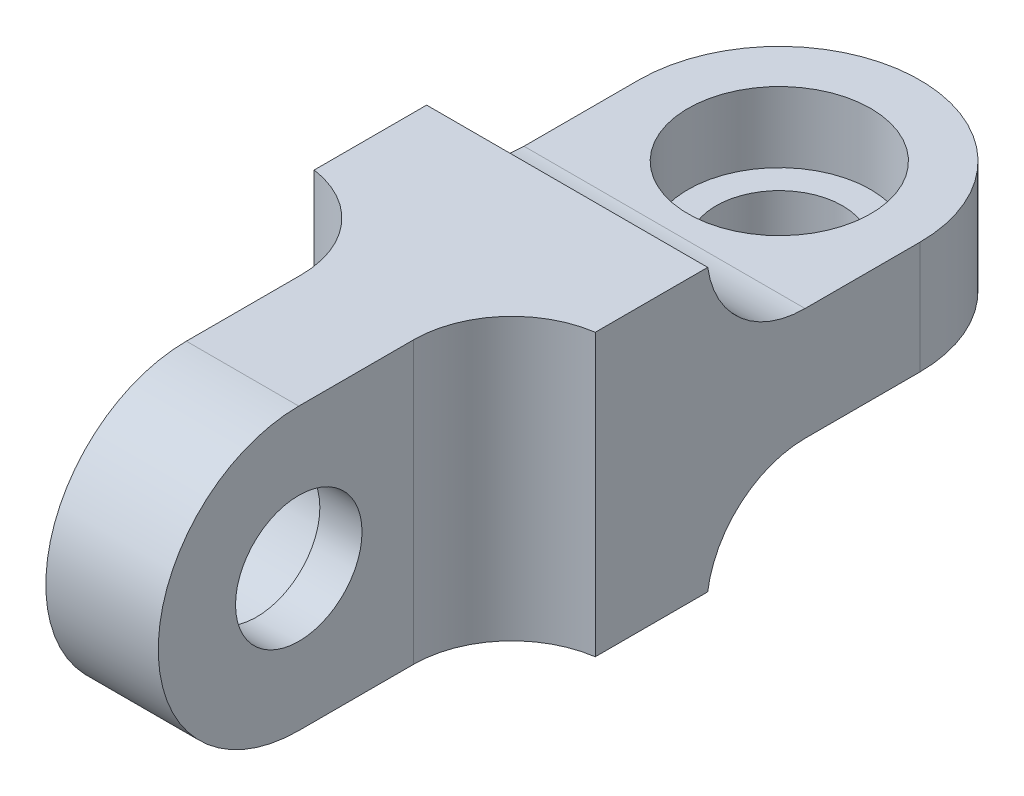
ISO-10303-21;
HEADER;
FILE_DESCRIPTION(('STEP AP214'),'2;1');
FILE_NAME('part.step','',(''),(''),'','','');
FILE_SCHEMA(('AUTOMOTIVE_DESIGN { 1 0 10303 214 1 1 1 1 }'));
ENDSEC;
DATA;
#1=APPLICATION_CONTEXT('core data for automotive mechanical design processes');
#2=APPLICATION_PROTOCOL_DEFINITION('international standard','automotive_design',2000,#1);
#3=PRODUCT_CONTEXT('',#1,'mechanical');
#4=PRODUCT('Part','Part','',(#3));
#5=PRODUCT_RELATED_PRODUCT_CATEGORY('part','',(#4));
#6=PRODUCT_DEFINITION_FORMATION('','',#4);
#7=PRODUCT_DEFINITION_CONTEXT('part definition',#1,'design');
#8=PRODUCT_DEFINITION('design','',#6,#7);
#9=PRODUCT_DEFINITION_SHAPE('','',#8);
#10=(LENGTH_UNIT() NAMED_UNIT(*) SI_UNIT(.MILLI.,.METRE.));
#11=(NAMED_UNIT(*) PLANE_ANGLE_UNIT() SI_UNIT($,.RADIAN.));
#12=(NAMED_UNIT(*) SI_UNIT($,.STERADIAN.) SOLID_ANGLE_UNIT());
#13=UNCERTAINTY_MEASURE_WITH_UNIT(LENGTH_MEASURE(1.E-05),#10,'distance_accuracy_value','');
#14=(GEOMETRIC_REPRESENTATION_CONTEXT(3) GLOBAL_UNCERTAINTY_ASSIGNED_CONTEXT((#13)) GLOBAL_UNIT_ASSIGNED_CONTEXT((#10,
#11,#12)) REPRESENTATION_CONTEXT('',''));
#15=CARTESIAN_POINT('',(0.,0.,0.));
#16=DIRECTION('',(0.,0.,1.));
#17=DIRECTION('',(1.,0.,0.));
#18=AXIS2_PLACEMENT_3D('',#15,#16,#17);
#19=CARTESIAN_POINT('',(10.,10.,60.));
#20=DIRECTION('',(-1.,0.,0.));
#21=DIRECTION('',(0.,-1.,0.));
#22=AXIS2_PLACEMENT_3D('',#19,#20,#21);
#23=PLANE('',#22);
#24=DIRECTION('',(0.,0.,-1.));
#25=VECTOR('',#24,1.);
#26=CARTESIAN_POINT('',(10.,-10.,60.));
#27=LINE('',#26,#25);
#28=CARTESIAN_POINT('',(9.99999999999994,-10.,34.));
#29=VERTEX_POINT('',#28);
#30=CARTESIAN_POINT('',(10.,-10.,26.));
#31=VERTEX_POINT('',#30);
#32=EDGE_CURVE('E210',#29,#31,#27,.T.);
#33=ORIENTED_EDGE('',*,*,#32,.T.);
#34=CARTESIAN_POINT('',(10.,-11.,19.0717967697245));
#35=DIRECTION('',(-1.,0.,0.));
#36=DIRECTION('',(0.,-1.,0.));
#37=AXIS2_PLACEMENT_3D('',#34,#35,#36);
#38=CIRCLE('',#37,7.);
#39=CARTESIAN_POINT('',(10.,-4.,19.0717967697245));
#40=VERTEX_POINT('',#39);
#41=EDGE_CURVE('E73',#31,#40,#38,.T.);
#42=ORIENTED_EDGE('',*,*,#41,.T.);
#43=DIRECTION('',(0.,0.,1.));
#44=VECTOR('',#43,1.);
#45=CARTESIAN_POINT('',(10.,-4.,0.));
#46=LINE('',#45,#44);
#47=CARTESIAN_POINT('',(10.,-4.,10.9027061529883));
#48=VERTEX_POINT('',#47);
#49=EDGE_CURVE('E217',#48,#40,#46,.T.);
#50=ORIENTED_EDGE('',*,*,#49,.F.);
#51=DIRECTION('',(0.,-1.,0.));
#52=VECTOR('',#51,1.);
#53=CARTESIAN_POINT('',(9.99999999999999,25.,10.9027061529883));
#54=LINE('',#53,#52);
#55=CARTESIAN_POINT('',(10.,4.,10.9027061529883));
#56=VERTEX_POINT('',#55);
#57=EDGE_CURVE('E205',#56,#48,#54,.T.);
#58=ORIENTED_EDGE('',*,*,#57,.F.);
#59=DIRECTION('',(0.,0.,-1.));
#60=VECTOR('',#59,1.);
#61=CARTESIAN_POINT('',(10.,4.,0.));
#62=LINE('',#61,#60);
#63=CARTESIAN_POINT('',(10.,4.,19.0717967697245));
#64=VERTEX_POINT('',#63);
#65=EDGE_CURVE('E216',#64,#56,#62,.T.);
#66=ORIENTED_EDGE('',*,*,#65,.F.);
#67=CARTESIAN_POINT('',(10.,11.,19.0717967697245));
#68=DIRECTION('',(-1.,0.,0.));
#69=DIRECTION('',(0.,-1.,0.));
#70=AXIS2_PLACEMENT_3D('',#67,#68,#69);
#71=CIRCLE('',#70,7.);
#72=CARTESIAN_POINT('',(10.,10.,26.));
#73=VERTEX_POINT('',#72);
#74=EDGE_CURVE('E262',#64,#73,#71,.T.);
#75=ORIENTED_EDGE('',*,*,#74,.T.);
#76=DIRECTION('',(0.,0.,-1.));
#77=VECTOR('',#76,1.);
#78=CARTESIAN_POINT('',(10.,10.,60.));
#79=LINE('',#78,#77);
#80=CARTESIAN_POINT('',(9.99999999999994,10.,34.));
#81=VERTEX_POINT('',#80);
#82=EDGE_CURVE('E201',#81,#73,#79,.T.);
#83=ORIENTED_EDGE('',*,*,#82,.F.);
#84=DIRECTION('',(0.,1.,0.));
#85=VECTOR('',#84,1.);
#86=CARTESIAN_POINT('',(9.99999999999994,-10.,34.));
#87=LINE('',#86,#85);
#88=EDGE_CURVE('E198',#29,#81,#87,.T.);
#89=ORIENTED_EDGE('',*,*,#88,.F.);
#90=EDGE_LOOP('',(#33,#42,#50,#58,#66,#75,#83,#89));
#91=FACE_BOUND('',#90,.T.);
#92=ADVANCED_FACE('F65',(#91),#23,.F.);
#93=CARTESIAN_POINT('',(-10.,10.,60.));
#94=DIRECTION('',(1.,0.,0.));
#95=DIRECTION('',(0.,1.,0.));
#96=AXIS2_PLACEMENT_3D('',#93,#94,#95);
#97=PLANE('',#96);
#98=DIRECTION('',(0.,0.,-1.));
#99=VECTOR('',#98,1.);
#100=CARTESIAN_POINT('',(-10.,10.,60.));
#101=LINE('',#100,#99);
#102=CARTESIAN_POINT('',(-10.,10.,34.));
#103=VERTEX_POINT('',#102);
#104=CARTESIAN_POINT('',(-10.,10.,26.));
#105=VERTEX_POINT('',#104);
#106=EDGE_CURVE('E242',#103,#105,#101,.T.);
#107=ORIENTED_EDGE('',*,*,#106,.T.);
#108=CARTESIAN_POINT('',(-10.,11.,19.0717967697245));
#109=DIRECTION('',(1.,0.,0.));
#110=DIRECTION('',(0.,1.,0.));
#111=AXIS2_PLACEMENT_3D('',#108,#109,#110);
#112=CIRCLE('',#111,7.);
#113=CARTESIAN_POINT('',(-10.,3.99999999999999,19.0717967697245));
#114=VERTEX_POINT('',#113);
#115=EDGE_CURVE('E264',#105,#114,#112,.T.);
#116=ORIENTED_EDGE('',*,*,#115,.T.);
#117=DIRECTION('',(0.,0.,-1.));
#118=VECTOR('',#117,1.);
#119=CARTESIAN_POINT('',(-10.,3.99999999999999,60.));
#120=LINE('',#119,#118);
#121=CARTESIAN_POINT('',(-10.,4.,10.9027061529883));
#122=VERTEX_POINT('',#121);
#123=EDGE_CURVE('E209',#114,#122,#120,.T.);
#124=ORIENTED_EDGE('',*,*,#123,.T.);
#125=DIRECTION('',(0.,-1.,0.));
#126=VECTOR('',#125,1.);
#127=CARTESIAN_POINT('',(-10.,25.,10.9027061529883));
#128=LINE('',#127,#126);
#129=CARTESIAN_POINT('',(-10.,-4.,10.9027061529883));
#130=VERTEX_POINT('',#129);
#131=EDGE_CURVE('E231',#122,#130,#128,.T.);
#132=ORIENTED_EDGE('',*,*,#131,.T.);
#133=DIRECTION('',(0.,0.,1.));
#134=VECTOR('',#133,1.);
#135=CARTESIAN_POINT('',(-10.,-4.00000000000001,60.));
#136=LINE('',#135,#134);
#137=CARTESIAN_POINT('',(-10.,-4.,19.0717967697245));
#138=VERTEX_POINT('',#137);
#139=EDGE_CURVE('E207',#130,#138,#136,.T.);
#140=ORIENTED_EDGE('',*,*,#139,.T.);
#141=CARTESIAN_POINT('',(-10.,-11.,19.0717967697245));
#142=DIRECTION('',(1.,0.,0.));
#143=DIRECTION('',(0.,1.,0.));
#144=AXIS2_PLACEMENT_3D('',#141,#142,#143);
#145=CIRCLE('',#144,7.);
#146=CARTESIAN_POINT('',(-10.,-10.,26.));
#147=VERTEX_POINT('',#146);
#148=EDGE_CURVE('E13',#138,#147,#145,.T.);
#149=ORIENTED_EDGE('',*,*,#148,.T.);
#150=DIRECTION('',(0.,0.,-1.));
#151=VECTOR('',#150,1.);
#152=CARTESIAN_POINT('',(-10.,-10.,60.));
#153=LINE('',#152,#151);
#154=CARTESIAN_POINT('',(-10.,-10.,34.));
#155=VERTEX_POINT('',#154);
#156=EDGE_CURVE('E244',#155,#147,#153,.T.);
#157=ORIENTED_EDGE('',*,*,#156,.F.);
#158=DIRECTION('',(0.,-1.,0.));
#159=VECTOR('',#158,1.);
#160=CARTESIAN_POINT('',(-10.,-10.,34.));
#161=LINE('',#160,#159);
#162=EDGE_CURVE('E191',#103,#155,#161,.T.);
#163=ORIENTED_EDGE('',*,*,#162,.F.);
#164=EDGE_LOOP('',(#107,#116,#124,#132,#140,#149,#157,#163));
#165=FACE_BOUND('',#164,.T.);
#166=ADVANCED_FACE('F268',(#165),#97,.F.);
#167=CARTESIAN_POINT('',(-10.,10.,60.));
#168=DIRECTION('',(0.,-1.,0.));
#169=DIRECTION('',(1.,0.,0.));
#170=AXIS2_PLACEMENT_3D('',#167,#168,#169);
#171=PLANE('',#170);
#172=ORIENTED_EDGE('',*,*,#82,.T.);
#173=DIRECTION('',(1.,0.,0.));
#174=VECTOR('',#173,1.);
#175=CARTESIAN_POINT('',(-24.,10.,26.));
#176=LINE('',#175,#174);
#177=EDGE_CURVE('E213',#105,#73,#176,.T.);
#178=ORIENTED_EDGE('',*,*,#177,.F.);
#179=ORIENTED_EDGE('',*,*,#106,.F.);
#180=CARTESIAN_POINT('',(-11.,10.,40.9282032302755));
#181=DIRECTION('',(0.,-1.,0.));
#182=DIRECTION('',(1.,0.,0.));
#183=AXIS2_PLACEMENT_3D('',#180,#181,#182);
#184=CIRCLE('',#183,7.);
#185=CARTESIAN_POINT('',(-4.00000000000003,9.99999999999999,40.9282032302755));
#186=VERTEX_POINT('',#185);
#187=EDGE_CURVE('E254',#103,#186,#184,.T.);
#188=ORIENTED_EDGE('',*,*,#187,.T.);
#189=DIRECTION('',(0.,0.,1.));
#190=VECTOR('',#189,1.);
#191=CARTESIAN_POINT('',(-4.00000000000003,9.99999999999999,60.));
#192=LINE('',#191,#190);
#193=CARTESIAN_POINT('',(-4.00000000000004,9.99999999999998,49.0972938470117));
#194=VERTEX_POINT('',#193);
#195=EDGE_CURVE('E174',#186,#194,#192,.T.);
#196=ORIENTED_EDGE('',*,*,#195,.T.);
#197=DIRECTION('',(1.,0.,0.));
#198=VECTOR('',#197,1.);
#199=CARTESIAN_POINT('',(-25.,9.99999999999991,49.0972938470117));
#200=LINE('',#199,#198);
#201=CARTESIAN_POINT('',(3.99999999999997,10.,49.0972938470117));
#202=VERTEX_POINT('',#201);
#203=EDGE_CURVE('E158',#194,#202,#200,.T.);
#204=ORIENTED_EDGE('',*,*,#203,.T.);
#205=DIRECTION('',(0.,0.,-1.));
#206=VECTOR('',#205,1.);
#207=CARTESIAN_POINT('',(3.99999999999997,10.,60.));
#208=LINE('',#207,#206);
#209=CARTESIAN_POINT('',(3.99999999999997,10.,40.9282032302755));
#210=VERTEX_POINT('',#209);
#211=EDGE_CURVE('E172',#202,#210,#208,.T.);
#212=ORIENTED_EDGE('',*,*,#211,.T.);
#213=CARTESIAN_POINT('',(11.,10.,40.9282032302755));
#214=DIRECTION('',(0.,-1.,0.));
#215=DIRECTION('',(1.,0.,0.));
#216=AXIS2_PLACEMENT_3D('',#213,#214,#215);
#217=CIRCLE('',#216,7.);
#218=EDGE_CURVE('E258',#210,#81,#217,.T.);
#219=ORIENTED_EDGE('',*,*,#218,.T.);
#220=EDGE_LOOP('',(#172,#178,#179,#188,#196,#204,#212,#219));
#221=FACE_BOUND('',#220,.T.);
#222=ADVANCED_FACE('F171',(#221),#171,.F.);
#223=CARTESIAN_POINT('',(-10.,-10.,60.));
#224=DIRECTION('',(0.,1.,0.));
#225=DIRECTION('',(0.,0.,1.));
#226=AXIS2_PLACEMENT_3D('',#223,#224,#225);
#227=PLANE('',#226);
#228=ORIENTED_EDGE('',*,*,#156,.T.);
#229=DIRECTION('',(1.,0.,0.));
#230=VECTOR('',#229,1.);
#231=CARTESIAN_POINT('',(-24.,-10.,26.));
#232=LINE('',#231,#230);
#233=EDGE_CURVE('E212',#147,#31,#232,.T.);
#234=ORIENTED_EDGE('',*,*,#233,.T.);
#235=ORIENTED_EDGE('',*,*,#32,.F.);
#236=CARTESIAN_POINT('',(11.,-10.,40.9282032302755));
#237=DIRECTION('',(0.,1.,0.));
#238=DIRECTION('',(0.,0.,1.));
#239=AXIS2_PLACEMENT_3D('',#236,#237,#238);
#240=CIRCLE('',#239,7.);
#241=CARTESIAN_POINT('',(4.00000000000004,-9.99999999999998,40.9282032302755));
#242=VERTEX_POINT('',#241);
#243=EDGE_CURVE('E260',#29,#242,#240,.T.);
#244=ORIENTED_EDGE('',*,*,#243,.T.);
#245=DIRECTION('',(0.,0.,-1.));
#246=VECTOR('',#245,1.);
#247=CARTESIAN_POINT('',(4.00000000000004,-9.99999999999998,60.));
#248=LINE('',#247,#246);
#249=CARTESIAN_POINT('',(4.00000000000004,-9.99999999999998,49.0972938470117));
#250=VERTEX_POINT('',#249);
#251=EDGE_CURVE('E182',#250,#242,#248,.T.);
#252=ORIENTED_EDGE('',*,*,#251,.F.);
#253=DIRECTION('',(1.,0.,0.));
#254=VECTOR('',#253,1.);
#255=CARTESIAN_POINT('',(-25.,-10.0000000000001,49.0972938470117));
#256=LINE('',#255,#254);
#257=CARTESIAN_POINT('',(-3.99999999999997,-10.,49.0972938470117));
#258=VERTEX_POINT('',#257);
#259=EDGE_CURVE('E161',#258,#250,#256,.T.);
#260=ORIENTED_EDGE('',*,*,#259,.F.);
#261=DIRECTION('',(0.,0.,1.));
#262=VECTOR('',#261,1.);
#263=CARTESIAN_POINT('',(-3.99999999999996,-10.,60.));
#264=LINE('',#263,#262);
#265=CARTESIAN_POINT('',(-3.99999999999996,-10.,40.9282032302755));
#266=VERTEX_POINT('',#265);
#267=EDGE_CURVE('E180',#266,#258,#264,.T.);
#268=ORIENTED_EDGE('',*,*,#267,.F.);
#269=CARTESIAN_POINT('',(-11.,-10.,40.9282032302755));
#270=DIRECTION('',(0.,1.,0.));
#271=DIRECTION('',(0.,0.,1.));
#272=AXIS2_PLACEMENT_3D('',#269,#270,#271);
#273=CIRCLE('',#272,7.);
#274=EDGE_CURVE('E256',#266,#155,#273,.T.);
#275=ORIENTED_EDGE('',*,*,#274,.T.);
#276=EDGE_LOOP('',(#228,#234,#235,#244,#252,#260,#268,#275));
#277=FACE_BOUND('',#276,.T.);
#278=ADVANCED_FACE('F288',(#277),#227,.F.);
#279=CARTESIAN_POINT('',(-24.,4.,0.));
#280=DIRECTION('',(0.,-1.,0.));
#281=DIRECTION('',(0.,0.,-1.));
#282=AXIS2_PLACEMENT_3D('',#279,#280,#281);
#283=PLANE('',#282);
#284=CARTESIAN_POINT('',(0.,4.,10.9027061529883));
#285=DIRECTION('',(0.,-1.,0.));
#286=DIRECTION('',(0.,0.,-1.));
#287=AXIS2_PLACEMENT_3D('',#284,#285,#286);
#288=CIRCLE('',#287,6.5);
#289=CARTESIAN_POINT('',(0.,4.,4.40270615298831));
#290=VERTEX_POINT('',#289);
#291=EDGE_CURVE('E223',#290,#290,#288,.T.);
#292=ORIENTED_EDGE('',*,*,#291,.T.);
#293=EDGE_LOOP('',(#292));
#294=FACE_BOUND('',#293,.T.);
#295=ORIENTED_EDGE('',*,*,#123,.F.);
#296=DIRECTION('',(1.,0.,0.));
#297=VECTOR('',#296,1.);
#298=CARTESIAN_POINT('',(-24.,3.99999999999999,19.0717967697245));
#299=LINE('',#298,#297);
#300=EDGE_CURVE('E250',#114,#64,#299,.T.);
#301=ORIENTED_EDGE('',*,*,#300,.T.);
#302=ORIENTED_EDGE('',*,*,#65,.T.);
#303=CARTESIAN_POINT('',(0.,4.,10.9027061529883));
#304=DIRECTION('',(0.,-1.,0.));
#305=DIRECTION('',(0.,0.,-1.));
#306=AXIS2_PLACEMENT_3D('',#303,#304,#305);
#307=CIRCLE('',#306,10.);
#308=EDGE_CURVE('E206',#122,#56,#307,.T.);
#309=ORIENTED_EDGE('',*,*,#308,.F.);
#310=EDGE_LOOP('',(#295,#301,#302,#309));
#311=FACE_BOUND('',#310,.T.);
#312=ADVANCED_FACE('F277',(#294,#311),#283,.F.);
#313=CARTESIAN_POINT('',(-24.,-4.,0.));
#314=DIRECTION('',(0.,1.,0.));
#315=DIRECTION('',(-1.,0.,0.));
#316=AXIS2_PLACEMENT_3D('',#313,#314,#315);
#317=PLANE('',#316);
#318=CARTESIAN_POINT('',(0.,-4.,10.9027061529883));
#319=DIRECTION('',(0.,-1.,0.));
#320=DIRECTION('',(0.,0.,-1.));
#321=AXIS2_PLACEMENT_3D('',#318,#319,#320);
#322=CIRCLE('',#321,4.5);
#323=CARTESIAN_POINT('',(0.,-4.,6.40270615298831));
#324=VERTEX_POINT('',#323);
#325=EDGE_CURVE('E237',#324,#324,#322,.T.);
#326=ORIENTED_EDGE('',*,*,#325,.F.);
#327=EDGE_LOOP('',(#326));
#328=FACE_BOUND('',#327,.T.);
#329=ORIENTED_EDGE('',*,*,#49,.T.);
#330=DIRECTION('',(-1.,0.,0.));
#331=VECTOR('',#330,1.);
#332=CARTESIAN_POINT('',(-24.,-4.,19.0717967697245));
#333=LINE('',#332,#331);
#334=EDGE_CURVE('E80',#40,#138,#333,.T.);
#335=ORIENTED_EDGE('',*,*,#334,.T.);
#336=ORIENTED_EDGE('',*,*,#139,.F.);
#337=CARTESIAN_POINT('',(0.,-4.,10.9027061529883));
#338=DIRECTION('',(0.,-1.,0.));
#339=DIRECTION('',(0.,0.,-1.));
#340=AXIS2_PLACEMENT_3D('',#337,#338,#339);
#341=CIRCLE('',#340,10.);
#342=EDGE_CURVE('E234',#130,#48,#341,.T.);
#343=ORIENTED_EDGE('',*,*,#342,.T.);
#344=EDGE_LOOP('',(#329,#335,#336,#343));
#345=FACE_BOUND('',#344,.T.);
#346=ADVANCED_FACE('F292',(#328,#345),#317,.F.);
#347=CARTESIAN_POINT('',(0.,-1.,10.9027061529883));
#348=DIRECTION('',(0.,1.,0.));
#349=DIRECTION('',(0.,0.,1.));
#350=AXIS2_PLACEMENT_3D('',#347,#348,#349);
#351=CYLINDRICAL_SURFACE('',#350,6.5);
#352=CARTESIAN_POINT('',(0.,-1.,10.9027061529883));
#353=DIRECTION('',(0.,-1.,0.));
#354=DIRECTION('',(0.,0.,-1.));
#355=AXIS2_PLACEMENT_3D('',#352,#353,#354);
#356=CIRCLE('',#355,6.5);
#357=CARTESIAN_POINT('',(0.,-1.,4.40270615298831));
#358=VERTEX_POINT('',#357);
#359=EDGE_CURVE('E219',#358,#358,#356,.T.);
#360=ORIENTED_EDGE('',*,*,#359,.T.);
#361=EDGE_LOOP('',(#360));
#362=FACE_BOUND('',#361,.T.);
#363=ORIENTED_EDGE('',*,*,#291,.F.);
#364=EDGE_LOOP('',(#363));
#365=FACE_BOUND('',#364,.T.);
#366=ADVANCED_FACE('F383',(#362,#365),#351,.F.);
#367=CARTESIAN_POINT('',(0.,-1.,10.9027061529883));
#368=DIRECTION('',(0.,-1.,0.));
#369=DIRECTION('',(0.,0.,-1.));
#370=AXIS2_PLACEMENT_3D('',#367,#368,#369);
#371=PLANE('',#370);
#372=CARTESIAN_POINT('',(0.,-1.,10.9027061529883));
#373=DIRECTION('',(0.,-1.,0.));
#374=DIRECTION('',(0.,0.,-1.));
#375=AXIS2_PLACEMENT_3D('',#372,#373,#374);
#376=CIRCLE('',#375,4.5);
#377=CARTESIAN_POINT('',(0.,-1.,6.40270615298831));
#378=VERTEX_POINT('',#377);
#379=EDGE_CURVE('E202',#378,#378,#376,.T.);
#380=ORIENTED_EDGE('',*,*,#379,.T.);
#381=EDGE_LOOP('',(#380));
#382=FACE_BOUND('',#381,.T.);
#383=ORIENTED_EDGE('',*,*,#359,.F.);
#384=EDGE_LOOP('',(#383));
#385=FACE_BOUND('',#384,.T.);
#386=ADVANCED_FACE('F307',(#382,#385),#371,.F.);
#387=CARTESIAN_POINT('',(0.,25.,10.9027061529883));
#388=DIRECTION('',(0.,-1.,0.));
#389=DIRECTION('',(0.,0.,-1.));
#390=AXIS2_PLACEMENT_3D('',#387,#388,#389);
#391=CYLINDRICAL_SURFACE('',#390,4.5);
#392=ORIENTED_EDGE('',*,*,#325,.T.);
#393=EDGE_LOOP('',(#392));
#394=FACE_BOUND('',#393,.T.);
#395=ORIENTED_EDGE('',*,*,#379,.F.);
#396=EDGE_LOOP('',(#395));
#397=FACE_BOUND('',#396,.T.);
#398=ADVANCED_FACE('F297',(#394,#397),#391,.F.);
#399=CARTESIAN_POINT('',(0.,25.,10.9027061529883));
#400=DIRECTION('',(0.,-1.,0.));
#401=DIRECTION('',(0.,0.,-1.));
#402=AXIS2_PLACEMENT_3D('',#399,#400,#401);
#403=CYLINDRICAL_SURFACE('',#402,10.);
#404=ORIENTED_EDGE('',*,*,#308,.T.);
#405=ORIENTED_EDGE('',*,*,#57,.T.);
#406=ORIENTED_EDGE('',*,*,#342,.F.);
#407=ORIENTED_EDGE('',*,*,#131,.F.);
#408=EDGE_LOOP('',(#404,#405,#406,#407));
#409=FACE_BOUND('',#408,.T.);
#410=ADVANCED_FACE('F294',(#409),#403,.T.);
#411=CARTESIAN_POINT('',(1.,0.,49.0972938470117));
#412=DIRECTION('',(1.,0.,0.));
#413=DIRECTION('',(0.,0.,1.));
#414=AXIS2_PLACEMENT_3D('',#411,#412,#413);
#415=PLANE('',#414);
#416=CARTESIAN_POINT('',(1.,0.,49.0972938470117));
#417=DIRECTION('',(1.,0.,0.));
#418=DIRECTION('',(0.,0.,-1.));
#419=AXIS2_PLACEMENT_3D('',#416,#417,#418);
#420=CIRCLE('',#419,4.5);
#421=CARTESIAN_POINT('',(1.,0.,44.5972938470117));
#422=VERTEX_POINT('',#421);
#423=EDGE_CURVE('E192',#422,#422,#420,.F.);
#424=ORIENTED_EDGE('',*,*,#423,.F.);
#425=EDGE_LOOP('',(#424));
#426=FACE_BOUND('',#425,.T.);
#427=CARTESIAN_POINT('',(1.,0.,49.0972938470117));
#428=DIRECTION('',(-1.,0.,0.));
#429=DIRECTION('',(0.,0.,1.));
#430=AXIS2_PLACEMENT_3D('',#427,#428,#429);
#431=CIRCLE('',#430,6.5);
#432=CARTESIAN_POINT('',(1.,0.,55.5972938470117));
#433=VERTEX_POINT('',#432);
#434=EDGE_CURVE('E184',#433,#433,#431,.T.);
#435=ORIENTED_EDGE('',*,*,#434,.T.);
#436=EDGE_LOOP('',(#435));
#437=FACE_BOUND('',#436,.T.);
#438=ADVANCED_FACE('F296',(#426,#437),#415,.F.);
#439=CARTESIAN_POINT('',(1.,0.,49.0972938470117));
#440=DIRECTION('',(-1.,0.,0.));
#441=DIRECTION('',(0.,0.,1.));
#442=AXIS2_PLACEMENT_3D('',#439,#440,#441);
#443=CYLINDRICAL_SURFACE('',#442,6.5);
#444=ORIENTED_EDGE('',*,*,#434,.F.);
#445=EDGE_LOOP('',(#444));
#446=FACE_BOUND('',#445,.T.);
#447=CARTESIAN_POINT('',(-4.,0.,49.0972938470117));
#448=DIRECTION('',(-1.,0.,0.));
#449=DIRECTION('',(0.,0.,1.));
#450=AXIS2_PLACEMENT_3D('',#447,#448,#449);
#451=CIRCLE('',#450,6.5);
#452=CARTESIAN_POINT('',(-4.,0.,55.5972938470117));
#453=VERTEX_POINT('',#452);
#454=EDGE_CURVE('E187',#453,#453,#451,.T.);
#455=ORIENTED_EDGE('',*,*,#454,.T.);
#456=EDGE_LOOP('',(#455));
#457=FACE_BOUND('',#456,.T.);
#458=ADVANCED_FACE('F303',(#446,#457),#443,.F.);
#459=CARTESIAN_POINT('',(-25.,0.,49.0972938470117));
#460=DIRECTION('',(1.,0.,0.));
#461=DIRECTION('',(0.,0.,-1.));
#462=AXIS2_PLACEMENT_3D('',#459,#460,#461);
#463=CYLINDRICAL_SURFACE('',#462,4.5);
#464=CARTESIAN_POINT('',(4.,0.,49.0972938470117));
#465=DIRECTION('',(-1.,0.,0.));
#466=DIRECTION('',(0.,0.,1.));
#467=AXIS2_PLACEMENT_3D('',#464,#465,#466);
#468=CIRCLE('',#467,4.5);
#469=CARTESIAN_POINT('',(4.,0.,53.5972938470117));
#470=VERTEX_POINT('',#469);
#471=EDGE_CURVE('E166',#470,#470,#468,.T.);
#472=ORIENTED_EDGE('',*,*,#471,.F.);
#473=EDGE_LOOP('',(#472));
#474=FACE_BOUND('',#473,.T.);
#475=ORIENTED_EDGE('',*,*,#423,.T.);
#476=EDGE_LOOP('',(#475));
#477=FACE_BOUND('',#476,.T.);
#478=ADVANCED_FACE('F371',(#474,#477),#463,.F.);
#479=CARTESIAN_POINT('',(-3.99999999999991,-24.,60.));
#480=DIRECTION('',(-1.,0.,0.));
#481=DIRECTION('',(0.,0.,1.));
#482=AXIS2_PLACEMENT_3D('',#479,#480,#481);
#483=PLANE('',#482);
#484=ORIENTED_EDGE('',*,*,#454,.F.);
#485=EDGE_LOOP('',(#484));
#486=FACE_BOUND('',#485,.T.);
#487=ORIENTED_EDGE('',*,*,#195,.F.);
#488=DIRECTION('',(0.,1.,0.));
#489=VECTOR('',#488,1.);
#490=CARTESIAN_POINT('',(-3.99999999999996,-10.,40.9282032302755));
#491=LINE('',#490,#489);
#492=EDGE_CURVE('E240',#186,#266,#491,.F.);
#493=ORIENTED_EDGE('',*,*,#492,.T.);
#494=ORIENTED_EDGE('',*,*,#267,.T.);
#495=CARTESIAN_POINT('',(-4.,0.,49.0972938470117));
#496=DIRECTION('',(-1.,0.,0.));
#497=DIRECTION('',(0.,0.,1.));
#498=AXIS2_PLACEMENT_3D('',#495,#496,#497);
#499=CIRCLE('',#498,10.);
#500=EDGE_CURVE('E195',#194,#258,#499,.F.);
#501=ORIENTED_EDGE('',*,*,#500,.F.);
#502=EDGE_LOOP('',(#487,#493,#494,#501));
#503=FACE_BOUND('',#502,.T.);
#504=ADVANCED_FACE('F366',(#486,#503),#483,.T.);
#505=CARTESIAN_POINT('',(-25.,0.,49.0972938470117));
#506=DIRECTION('',(1.,0.,0.));
#507=DIRECTION('',(0.,0.,-1.));
#508=AXIS2_PLACEMENT_3D('',#505,#506,#507);
#509=CYLINDRICAL_SURFACE('',#508,10.);
#510=ORIENTED_EDGE('',*,*,#500,.T.);
#511=ORIENTED_EDGE('',*,*,#259,.T.);
#512=CARTESIAN_POINT('',(4.,0.,49.0972938470117));
#513=DIRECTION('',(-1.,0.,0.));
#514=DIRECTION('',(0.,0.,1.));
#515=AXIS2_PLACEMENT_3D('',#512,#513,#514);
#516=CIRCLE('',#515,10.);
#517=EDGE_CURVE('E154',#250,#202,#516,.T.);
#518=ORIENTED_EDGE('',*,*,#517,.T.);
#519=ORIENTED_EDGE('',*,*,#203,.F.);
#520=EDGE_LOOP('',(#510,#511,#518,#519));
#521=FACE_BOUND('',#520,.T.);
#522=ADVANCED_FACE('F157',(#521),#509,.T.);
#523=CARTESIAN_POINT('',(4.00000000000009,-24.,60.));
#524=DIRECTION('',(1.,0.,0.));
#525=DIRECTION('',(0.,1.,0.));
#526=AXIS2_PLACEMENT_3D('',#523,#524,#525);
#527=PLANE('',#526);
#528=ORIENTED_EDGE('',*,*,#471,.T.);
#529=EDGE_LOOP('',(#528));
#530=FACE_BOUND('',#529,.T.);
#531=ORIENTED_EDGE('',*,*,#251,.T.);
#532=DIRECTION('',(0.,-1.,0.));
#533=VECTOR('',#532,1.);
#534=CARTESIAN_POINT('',(3.99999999999997,10.,40.9282032302755));
#535=LINE('',#534,#533);
#536=EDGE_CURVE('E179',#242,#210,#535,.F.);
#537=ORIENTED_EDGE('',*,*,#536,.T.);
#538=ORIENTED_EDGE('',*,*,#211,.F.);
#539=ORIENTED_EDGE('',*,*,#517,.F.);
#540=EDGE_LOOP('',(#531,#537,#538,#539));
#541=FACE_BOUND('',#540,.T.);
#542=ADVANCED_FACE('F177',(#530,#541),#527,.T.);
#543=CARTESIAN_POINT('',(-11.,0.,40.9282032302755));
#544=DIRECTION('',(0.,-1.,0.));
#545=DIRECTION('',(1.,0.,0.));
#546=AXIS2_PLACEMENT_3D('',#543,#544,#545);
#547=CYLINDRICAL_SURFACE('',#546,7.);
#548=ORIENTED_EDGE('',*,*,#274,.F.);
#549=ORIENTED_EDGE('',*,*,#492,.F.);
#550=ORIENTED_EDGE('',*,*,#187,.F.);
#551=ORIENTED_EDGE('',*,*,#162,.T.);
#552=EDGE_LOOP('',(#548,#549,#550,#551));
#553=FACE_BOUND('',#552,.T.);
#554=ADVANCED_FACE('F306',(#553),#547,.F.);
#555=CARTESIAN_POINT('',(11.,0.,40.9282032302755));
#556=DIRECTION('',(0.,1.,0.));
#557=DIRECTION('',(-1.,0.,0.));
#558=AXIS2_PLACEMENT_3D('',#555,#556,#557);
#559=CYLINDRICAL_SURFACE('',#558,7.);
#560=ORIENTED_EDGE('',*,*,#243,.F.);
#561=ORIENTED_EDGE('',*,*,#88,.T.);
#562=ORIENTED_EDGE('',*,*,#218,.F.);
#563=ORIENTED_EDGE('',*,*,#536,.F.);
#564=EDGE_LOOP('',(#560,#561,#562,#563));
#565=FACE_BOUND('',#564,.T.);
#566=ADVANCED_FACE('F285',(#565),#559,.F.);
#567=CARTESIAN_POINT('',(-24.,11.,19.0717967697245));
#568=DIRECTION('',(1.,0.,0.));
#569=DIRECTION('',(0.,1.,0.));
#570=AXIS2_PLACEMENT_3D('',#567,#568,#569);
#571=CYLINDRICAL_SURFACE('',#570,7.);
#572=ORIENTED_EDGE('',*,*,#115,.F.);
#573=ORIENTED_EDGE('',*,*,#177,.T.);
#574=ORIENTED_EDGE('',*,*,#74,.F.);
#575=ORIENTED_EDGE('',*,*,#300,.F.);
#576=EDGE_LOOP('',(#572,#573,#574,#575));
#577=FACE_BOUND('',#576,.T.);
#578=ADVANCED_FACE('F279',(#577),#571,.F.);
#579=CARTESIAN_POINT('',(-24.,-11.,19.0717967697245));
#580=DIRECTION('',(-1.,0.,0.));
#581=DIRECTION('',(0.,0.,1.));
#582=AXIS2_PLACEMENT_3D('',#579,#580,#581);
#583=CYLINDRICAL_SURFACE('',#582,7.);
#584=ORIENTED_EDGE('',*,*,#148,.F.);
#585=ORIENTED_EDGE('',*,*,#334,.F.);
#586=ORIENTED_EDGE('',*,*,#41,.F.);
#587=ORIENTED_EDGE('',*,*,#233,.F.);
#588=EDGE_LOOP('',(#584,#585,#586,#587));
#589=FACE_BOUND('',#588,.T.);
#590=ADVANCED_FACE('F67',(#589),#583,.F.);
#591=CLOSED_SHELL('',(#92,#166,#222,#278,#312,#346,#366,#386,#398,#410,#438,#458,#478,#504,#522,
#542,#554,#566,#578,#590));
#592=MANIFOLD_SOLID_BREP('B2',#591);
#593=ADVANCED_BREP_SHAPE_REPRESENTATION('',(#18,#592),#14);
#594=SHAPE_DEFINITION_REPRESENTATION(#9,#593);
ENDSEC;
END-ISO-10303-21;
